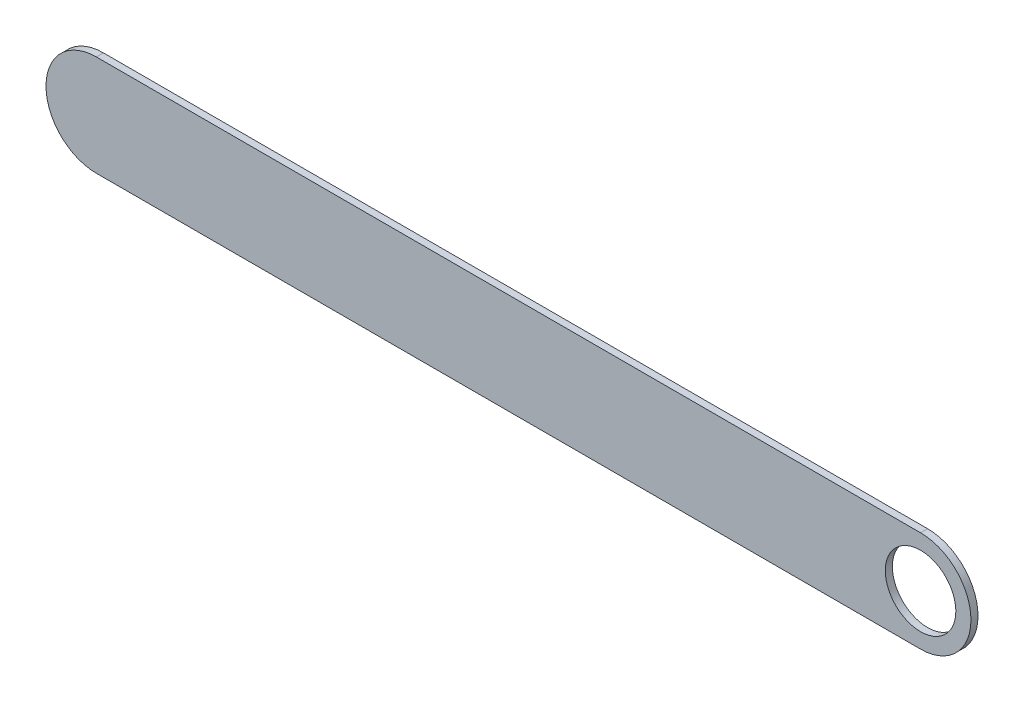
ISO-10303-21;
HEADER;
FILE_DESCRIPTION(('STEP AP214'),'2;1');
FILE_NAME('part.step','',(''),(''),'','','');
FILE_SCHEMA(('AUTOMOTIVE_DESIGN { 1 0 10303 214 1 1 1 1 }'));
ENDSEC;
DATA;
#1=APPLICATION_CONTEXT('core data for automotive mechanical design processes');
#2=APPLICATION_PROTOCOL_DEFINITION('international standard','automotive_design',2000,#1);
#3=PRODUCT_CONTEXT('',#1,'mechanical');
#4=PRODUCT('Part','Part','',(#3));
#5=PRODUCT_RELATED_PRODUCT_CATEGORY('part','',(#4));
#6=PRODUCT_DEFINITION_FORMATION('','',#4);
#7=PRODUCT_DEFINITION_CONTEXT('part definition',#1,'design');
#8=PRODUCT_DEFINITION('design','',#6,#7);
#9=PRODUCT_DEFINITION_SHAPE('','',#8);
#10=(LENGTH_UNIT() NAMED_UNIT(*) SI_UNIT(.MILLI.,.METRE.));
#11=(NAMED_UNIT(*) PLANE_ANGLE_UNIT() SI_UNIT($,.RADIAN.));
#12=(NAMED_UNIT(*) SI_UNIT($,.STERADIAN.) SOLID_ANGLE_UNIT());
#13=UNCERTAINTY_MEASURE_WITH_UNIT(LENGTH_MEASURE(1.E-05),#10,'distance_accuracy_value','');
#14=(GEOMETRIC_REPRESENTATION_CONTEXT(3) GLOBAL_UNCERTAINTY_ASSIGNED_CONTEXT((#13)) GLOBAL_UNIT_ASSIGNED_CONTEXT((#10,
#11,#12)) REPRESENTATION_CONTEXT('',''));
#15=CARTESIAN_POINT('',(0.,0.,0.));
#16=DIRECTION('',(0.,0.,1.));
#17=DIRECTION('',(1.,0.,0.));
#18=AXIS2_PLACEMENT_3D('',#15,#16,#17);
#19=CARTESIAN_POINT('',(116.26,-55.31,-0.045));
#20=DIRECTION('',(0.,0.,-1.));
#21=DIRECTION('',(0.,-1.,0.));
#22=AXIS2_PLACEMENT_3D('',#19,#20,#21);
#23=CYLINDRICAL_SURFACE('',#22,0.175);
#24=CARTESIAN_POINT('',(116.26,-55.31,1.6));
#25=DIRECTION('',(0.,0.,-1.));
#26=DIRECTION('',(0.,-1.,0.));
#27=AXIS2_PLACEMENT_3D('',#24,#25,#26);
#28=CIRCLE('',#27,0.175);
#29=CARTESIAN_POINT('',(116.26,-55.485,1.6));
#30=VERTEX_POINT('',#29);
#31=EDGE_CURVE('E124',#30,#30,#28,.T.);
#32=ORIENTED_EDGE('',*,*,#31,.T.);
#33=DIRECTION('',(0.,0.,1.));
#34=VECTOR('',#33,1.);
#35=CARTESIAN_POINT('',(116.26,-55.485,-0.045));
#36=LINE('',#35,#34);
#37=CARTESIAN_POINT('',(116.26,-55.485,1.635));
#38=VERTEX_POINT('',#37);
#39=EDGE_CURVE('E11',#30,#38,#36,.T.);
#40=ORIENTED_EDGE('',*,*,#39,.T.);
#41=CARTESIAN_POINT('',(116.26,-55.31,1.635));
#42=DIRECTION('',(0.,0.,-1.));
#43=DIRECTION('',(0.,-1.,0.));
#44=AXIS2_PLACEMENT_3D('',#41,#42,#43);
#45=CIRCLE('',#44,0.175);
#46=EDGE_CURVE('E26',#38,#38,#45,.T.);
#47=ORIENTED_EDGE('',*,*,#46,.F.);
#48=ORIENTED_EDGE('',*,*,#39,.F.);
#49=EDGE_LOOP('',(#32,#40,#47,#48));
#50=FACE_BOUND('',#49,.T.);
#51=ADVANCED_FACE('F17',(#50),#23,.F.);
#52=CARTESIAN_POINT('',(116.26,-55.06,1.6));
#53=DIRECTION('',(0.,-1.,0.));
#54=DIRECTION('',(0.,0.,-1.));
#55=AXIS2_PLACEMENT_3D('',#52,#53,#54);
#56=PLANE('',#55);
#57=DIRECTION('',(-1.,0.,0.));
#58=VECTOR('',#57,1.);
#59=CARTESIAN_POINT('',(116.26,-55.06,1.6));
#60=LINE('',#59,#58);
#61=CARTESIAN_POINT('',(116.26,-55.06,1.6));
#62=VERTEX_POINT('',#61);
#63=CARTESIAN_POINT('',(112.17,-55.06,1.6));
#64=VERTEX_POINT('',#63);
#65=EDGE_CURVE('E76',#62,#64,#60,.T.);
#66=ORIENTED_EDGE('',*,*,#65,.T.);
#67=DIRECTION('',(0.,0.,1.));
#68=VECTOR('',#67,1.);
#69=CARTESIAN_POINT('',(112.17,-55.06,1.6));
#70=LINE('',#69,#68);
#71=CARTESIAN_POINT('',(112.17,-55.06,1.635));
#72=VERTEX_POINT('',#71);
#73=EDGE_CURVE('E100',#64,#72,#70,.T.);
#74=ORIENTED_EDGE('',*,*,#73,.T.);
#75=DIRECTION('',(-1.,0.,0.));
#76=VECTOR('',#75,1.);
#77=CARTESIAN_POINT('',(116.26,-55.06,1.635));
#78=LINE('',#77,#76);
#79=CARTESIAN_POINT('',(116.26,-55.06,1.635));
#80=VERTEX_POINT('',#79);
#81=EDGE_CURVE('E20',#80,#72,#78,.T.);
#82=ORIENTED_EDGE('',*,*,#81,.F.);
#83=DIRECTION('',(0.,0.,1.));
#84=VECTOR('',#83,1.);
#85=CARTESIAN_POINT('',(116.26,-55.06,1.6));
#86=LINE('',#85,#84);
#87=EDGE_CURVE('E99',#62,#80,#86,.T.);
#88=ORIENTED_EDGE('',*,*,#87,.F.);
#89=EDGE_LOOP('',(#66,#74,#82,#88));
#90=FACE_BOUND('',#89,.T.);
#91=ADVANCED_FACE('F142',(#90),#56,.F.);
#92=CARTESIAN_POINT('',(112.17,-55.56,1.635));
#93=DIRECTION('',(0.,0.,1.));
#94=DIRECTION('',(1.,0.,0.));
#95=AXIS2_PLACEMENT_3D('',#92,#93,#94);
#96=PLANE('',#95);
#97=ORIENTED_EDGE('',*,*,#46,.T.);
#98=EDGE_LOOP('',(#97));
#99=FACE_BOUND('',#98,.T.);
#100=DIRECTION('',(1.,0.,0.));
#101=VECTOR('',#100,1.);
#102=CARTESIAN_POINT('',(112.17,-55.56,1.635));
#103=LINE('',#102,#101);
#104=CARTESIAN_POINT('',(112.17,-55.56,1.635));
#105=VERTEX_POINT('',#104);
#106=CARTESIAN_POINT('',(116.26,-55.56,1.635));
#107=VERTEX_POINT('',#106);
#108=EDGE_CURVE('E110',#105,#107,#103,.T.);
#109=ORIENTED_EDGE('',*,*,#108,.T.);
#110=CARTESIAN_POINT('',(116.26,-55.31,1.635));
#111=DIRECTION('',(0.,0.,1.));
#112=DIRECTION('',(0.,-1.,0.));
#113=AXIS2_PLACEMENT_3D('',#110,#111,#112);
#114=CIRCLE('',#113,0.25);
#115=EDGE_CURVE('E105',#107,#80,#114,.T.);
#116=ORIENTED_EDGE('',*,*,#115,.T.);
#117=ORIENTED_EDGE('',*,*,#81,.T.);
#118=CARTESIAN_POINT('',(112.17,-55.31,1.635));
#119=DIRECTION('',(0.,0.,1.));
#120=DIRECTION('',(0.,1.,0.));
#121=AXIS2_PLACEMENT_3D('',#118,#119,#120);
#122=CIRCLE('',#121,0.25);
#123=EDGE_CURVE('E120',#72,#105,#122,.T.);
#124=ORIENTED_EDGE('',*,*,#123,.T.);
#125=EDGE_LOOP('',(#109,#116,#117,#124));
#126=FACE_BOUND('',#125,.T.);
#127=ADVANCED_FACE('F214',(#99,#126),#96,.T.);
#128=CARTESIAN_POINT('',(112.17,-55.56,1.6));
#129=DIRECTION('',(0.,0.,1.));
#130=DIRECTION('',(1.,0.,0.));
#131=AXIS2_PLACEMENT_3D('',#128,#129,#130);
#132=PLANE('',#131);
#133=ORIENTED_EDGE('',*,*,#31,.F.);
#134=EDGE_LOOP('',(#133));
#135=FACE_BOUND('',#134,.T.);
#136=CARTESIAN_POINT('',(112.17,-55.31,1.6));
#137=DIRECTION('',(0.,0.,1.));
#138=DIRECTION('',(0.,1.,0.));
#139=AXIS2_PLACEMENT_3D('',#136,#137,#138);
#140=CIRCLE('',#139,0.25);
#141=CARTESIAN_POINT('',(112.17,-55.56,1.6));
#142=VERTEX_POINT('',#141);
#143=EDGE_CURVE('E86',#64,#142,#140,.T.);
#144=ORIENTED_EDGE('',*,*,#143,.F.);
#145=ORIENTED_EDGE('',*,*,#65,.F.);
#146=CARTESIAN_POINT('',(116.26,-55.31,1.6));
#147=DIRECTION('',(0.,0.,1.));
#148=DIRECTION('',(0.,-1.,0.));
#149=AXIS2_PLACEMENT_3D('',#146,#147,#148);
#150=CIRCLE('',#149,0.25);
#151=CARTESIAN_POINT('',(116.26,-55.56,1.6));
#152=VERTEX_POINT('',#151);
#153=EDGE_CURVE('E91',#152,#62,#150,.T.);
#154=ORIENTED_EDGE('',*,*,#153,.F.);
#155=DIRECTION('',(1.,0.,0.));
#156=VECTOR('',#155,1.);
#157=CARTESIAN_POINT('',(112.17,-55.56,1.6));
#158=LINE('',#157,#156);
#159=EDGE_CURVE('E95',#142,#152,#158,.T.);
#160=ORIENTED_EDGE('',*,*,#159,.F.);
#161=EDGE_LOOP('',(#144,#145,#154,#160));
#162=FACE_BOUND('',#161,.T.);
#163=ADVANCED_FACE('F93',(#135,#162),#132,.F.);
#164=CARTESIAN_POINT('',(116.26,-55.31,1.6));
#165=DIRECTION('',(0.,0.,-1.));
#166=DIRECTION('',(0.,-1.,0.));
#167=AXIS2_PLACEMENT_3D('',#164,#165,#166);
#168=CYLINDRICAL_SURFACE('',#167,0.25);
#169=ORIENTED_EDGE('',*,*,#153,.T.);
#170=ORIENTED_EDGE('',*,*,#87,.T.);
#171=ORIENTED_EDGE('',*,*,#115,.F.);
#172=DIRECTION('',(0.,0.,1.));
#173=VECTOR('',#172,1.);
#174=CARTESIAN_POINT('',(116.26,-55.56,1.6));
#175=LINE('',#174,#173);
#176=EDGE_CURVE('E103',#152,#107,#175,.T.);
#177=ORIENTED_EDGE('',*,*,#176,.F.);
#178=EDGE_LOOP('',(#169,#170,#171,#177));
#179=FACE_BOUND('',#178,.T.);
#180=ADVANCED_FACE('F104',(#179),#168,.T.);
#181=CARTESIAN_POINT('',(112.17,-55.31,1.6));
#182=DIRECTION('',(0.,0.,-1.));
#183=DIRECTION('',(0.,1.,0.));
#184=AXIS2_PLACEMENT_3D('',#181,#182,#183);
#185=CYLINDRICAL_SURFACE('',#184,0.25);
#186=ORIENTED_EDGE('',*,*,#143,.T.);
#187=DIRECTION('',(0.,0.,1.));
#188=VECTOR('',#187,1.);
#189=CARTESIAN_POINT('',(112.17,-55.56,1.6));
#190=LINE('',#189,#188);
#191=EDGE_CURVE('E113',#142,#105,#190,.T.);
#192=ORIENTED_EDGE('',*,*,#191,.T.);
#193=ORIENTED_EDGE('',*,*,#123,.F.);
#194=ORIENTED_EDGE('',*,*,#73,.F.);
#195=EDGE_LOOP('',(#186,#192,#193,#194));
#196=FACE_BOUND('',#195,.T.);
#197=ADVANCED_FACE('F144',(#196),#185,.T.);
#198=CARTESIAN_POINT('',(112.17,-55.56,1.6));
#199=DIRECTION('',(0.,1.,0.));
#200=DIRECTION('',(1.,0.,0.));
#201=AXIS2_PLACEMENT_3D('',#198,#199,#200);
#202=PLANE('',#201);
#203=ORIENTED_EDGE('',*,*,#159,.T.);
#204=ORIENTED_EDGE('',*,*,#176,.T.);
#205=ORIENTED_EDGE('',*,*,#108,.F.);
#206=ORIENTED_EDGE('',*,*,#191,.F.);
#207=EDGE_LOOP('',(#203,#204,#205,#206));
#208=FACE_BOUND('',#207,.T.);
#209=ADVANCED_FACE('F112',(#208),#202,.F.);
#210=CLOSED_SHELL('',(#51,#91,#127,#163,#180,#197,#209));
#211=MANIFOLD_SOLID_BREP('B1',#210);
#212=ADVANCED_BREP_SHAPE_REPRESENTATION('',(#18,#211),#14);
#213=SHAPE_DEFINITION_REPRESENTATION(#9,#212);
ENDSEC;
END-ISO-10303-21;
